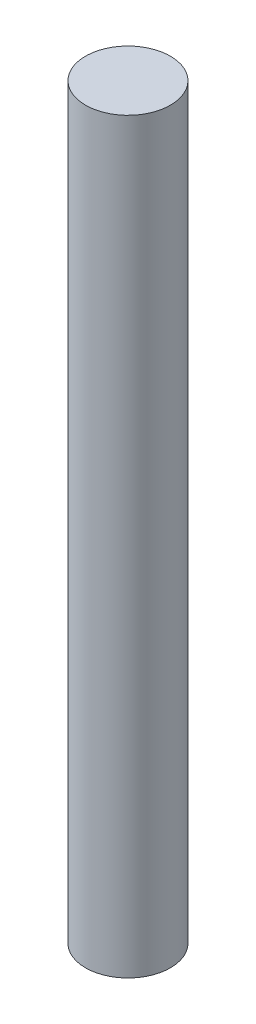
ISO-10303-21;
HEADER;
FILE_DESCRIPTION(('STEP AP214'),'2;1');
FILE_NAME('part.step','',(''),(''),'','','');
FILE_SCHEMA(('AUTOMOTIVE_DESIGN { 1 0 10303 214 1 1 1 1 }'));
ENDSEC;
DATA;
#1=APPLICATION_CONTEXT('core data for automotive mechanical design processes');
#2=APPLICATION_PROTOCOL_DEFINITION('international standard','automotive_design',2000,#1);
#3=PRODUCT_CONTEXT('',#1,'mechanical');
#4=PRODUCT('Part','Part','',(#3));
#5=PRODUCT_RELATED_PRODUCT_CATEGORY('part','',(#4));
#6=PRODUCT_DEFINITION_FORMATION('','',#4);
#7=PRODUCT_DEFINITION_CONTEXT('part definition',#1,'design');
#8=PRODUCT_DEFINITION('design','',#6,#7);
#9=PRODUCT_DEFINITION_SHAPE('','',#8);
#10=(LENGTH_UNIT() NAMED_UNIT(*) SI_UNIT(.MILLI.,.METRE.));
#11=(NAMED_UNIT(*) PLANE_ANGLE_UNIT() SI_UNIT($,.RADIAN.));
#12=(NAMED_UNIT(*) SI_UNIT($,.STERADIAN.) SOLID_ANGLE_UNIT());
#13=UNCERTAINTY_MEASURE_WITH_UNIT(LENGTH_MEASURE(1.E-05),#10,'distance_accuracy_value','');
#14=(GEOMETRIC_REPRESENTATION_CONTEXT(3) GLOBAL_UNCERTAINTY_ASSIGNED_CONTEXT((#13)) GLOBAL_UNIT_ASSIGNED_CONTEXT((#10,
#11,#12)) REPRESENTATION_CONTEXT('',''));
#15=CARTESIAN_POINT('',(0.,0.,0.));
#16=DIRECTION('',(0.,0.,1.));
#17=DIRECTION('',(1.,0.,0.));
#18=AXIS2_PLACEMENT_3D('',#15,#16,#17);
#19=CARTESIAN_POINT('',(0.,139.7,0.));
#20=DIRECTION('',(0.,-1.,0.));
#21=DIRECTION('',(0.,0.,-1.));
#22=AXIS2_PLACEMENT_3D('',#19,#20,#21);
#23=CYLINDRICAL_SURFACE('',#22,7.9375);
#24=CARTESIAN_POINT('',(0.,139.7,0.));
#25=DIRECTION('',(0.,1.,0.));
#26=DIRECTION('',(0.,0.,1.));
#27=AXIS2_PLACEMENT_3D('',#24,#25,#26);
#28=CIRCLE('',#27,7.9375);
#29=CARTESIAN_POINT('',(0.,139.7,7.9375));
#30=VERTEX_POINT('',#29);
#31=EDGE_CURVE('E10',#30,#30,#28,.T.);
#32=ORIENTED_EDGE('',*,*,#31,.F.);
#33=EDGE_LOOP('',(#32));
#34=FACE_BOUND('',#33,.T.);
#35=CARTESIAN_POINT('',(0.,0.,0.));
#36=DIRECTION('',(0.,1.,0.));
#37=DIRECTION('',(0.,0.,1.));
#38=AXIS2_PLACEMENT_3D('',#35,#36,#37);
#39=CIRCLE('',#38,7.9375);
#40=CARTESIAN_POINT('',(0.,0.,7.9375));
#41=VERTEX_POINT('',#40);
#42=EDGE_CURVE('E42',#41,#41,#39,.T.);
#43=ORIENTED_EDGE('',*,*,#42,.T.);
#44=EDGE_LOOP('',(#43));
#45=FACE_BOUND('',#44,.T.);
#46=ADVANCED_FACE('F39',(#34,#45),#23,.T.);
#47=CARTESIAN_POINT('',(0.,139.7,0.));
#48=DIRECTION('',(0.,1.,0.));
#49=DIRECTION('',(0.,0.,1.));
#50=AXIS2_PLACEMENT_3D('',#47,#48,#49);
#51=PLANE('',#50);
#52=ORIENTED_EDGE('',*,*,#31,.T.);
#53=EDGE_LOOP('',(#52));
#54=FACE_BOUND('',#53,.T.);
#55=ADVANCED_FACE('F56',(#54),#51,.T.);
#56=CARTESIAN_POINT('',(0.,0.,0.));
#57=DIRECTION('',(0.,1.,0.));
#58=DIRECTION('',(0.,0.,1.));
#59=AXIS2_PLACEMENT_3D('',#56,#57,#58);
#60=PLANE('',#59);
#61=ORIENTED_EDGE('',*,*,#42,.F.);
#62=EDGE_LOOP('',(#61));
#63=FACE_BOUND('',#62,.T.);
#64=ADVANCED_FACE('F54',(#63),#60,.F.);
#65=CLOSED_SHELL('',(#46,#55,#64));
#66=MANIFOLD_SOLID_BREP('B2',#65);
#67=ADVANCED_BREP_SHAPE_REPRESENTATION('',(#18,#66),#14);
#68=SHAPE_DEFINITION_REPRESENTATION(#9,#67);
ENDSEC;
END-ISO-10303-21;
